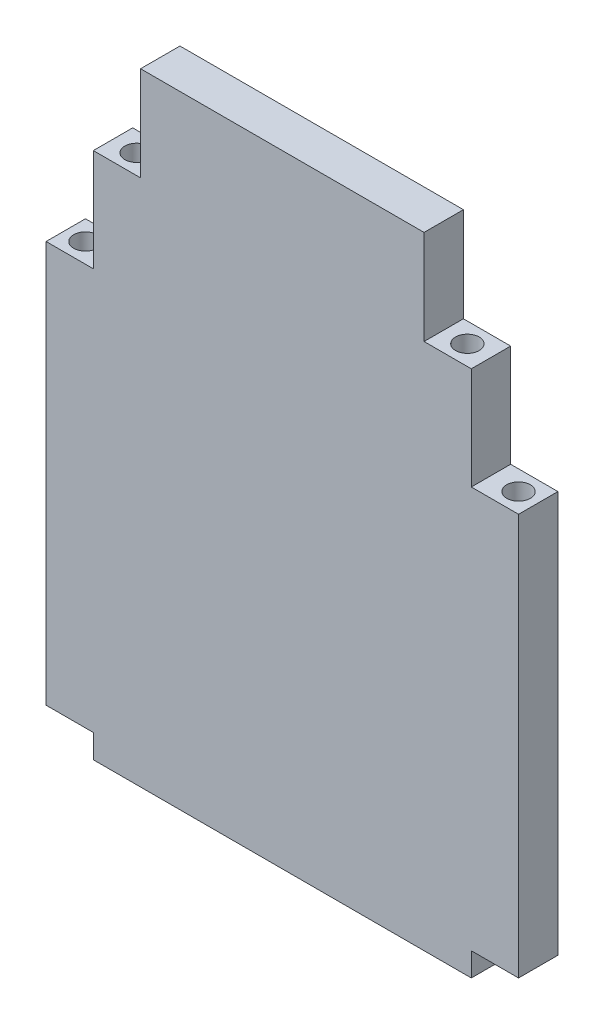
ISO-10303-21;
HEADER;
FILE_DESCRIPTION(('STEP AP214'),'2;1');
FILE_NAME('part.step','',(''),(''),'','','');
FILE_SCHEMA(('AUTOMOTIVE_DESIGN { 1 0 10303 214 1 1 1 1 }'));
ENDSEC;
DATA;
#1=APPLICATION_CONTEXT('core data for automotive mechanical design processes');
#2=APPLICATION_PROTOCOL_DEFINITION('international standard','automotive_design',2000,#1);
#3=PRODUCT_CONTEXT('',#1,'mechanical');
#4=PRODUCT('Part','Part','',(#3));
#5=PRODUCT_RELATED_PRODUCT_CATEGORY('part','',(#4));
#6=PRODUCT_DEFINITION_FORMATION('','',#4);
#7=PRODUCT_DEFINITION_CONTEXT('part definition',#1,'design');
#8=PRODUCT_DEFINITION('design','',#6,#7);
#9=PRODUCT_DEFINITION_SHAPE('','',#8);
#10=(LENGTH_UNIT() NAMED_UNIT(*) SI_UNIT(.MILLI.,.METRE.));
#11=(NAMED_UNIT(*) PLANE_ANGLE_UNIT() SI_UNIT($,.RADIAN.));
#12=(NAMED_UNIT(*) SI_UNIT($,.STERADIAN.) SOLID_ANGLE_UNIT());
#13=UNCERTAINTY_MEASURE_WITH_UNIT(LENGTH_MEASURE(1.E-05),#10,'distance_accuracy_value','');
#14=(GEOMETRIC_REPRESENTATION_CONTEXT(3) GLOBAL_UNCERTAINTY_ASSIGNED_CONTEXT((#13)) GLOBAL_UNIT_ASSIGNED_CONTEXT((#10,
#11,#12)) REPRESENTATION_CONTEXT('',''));
#15=CARTESIAN_POINT('',(0.,0.,0.));
#16=DIRECTION('',(0.,0.,1.));
#17=DIRECTION('',(1.,0.,0.));
#18=AXIS2_PLACEMENT_3D('',#15,#16,#17);
#19=CARTESIAN_POINT('',(-30.,25.5,5.));
#20=DIRECTION('',(0.,-1.,0.));
#21=DIRECTION('',(0.,0.,-1.));
#22=AXIS2_PLACEMENT_3D('',#19,#20,#21);
#23=PLANE('',#22);
#24=CARTESIAN_POINT('',(-27.5,25.5000000000001,2.5));
#25=DIRECTION('',(0.,1.,0.));
#26=DIRECTION('',(-1.,0.,0.));
#27=AXIS2_PLACEMENT_3D('',#24,#25,#26);
#28=CIRCLE('',#27,1.5);
#29=CARTESIAN_POINT('',(-29.,25.5000000000001,2.5));
#30=VERTEX_POINT('',#29);
#31=EDGE_CURVE('E314',#30,#30,#28,.T.);
#32=ORIENTED_EDGE('',*,*,#31,.F.);
#33=EDGE_LOOP('',(#32));
#34=FACE_BOUND('',#33,.T.);
#35=DIRECTION('',(-1.,0.,0.));
#36=VECTOR('',#35,1.);
#37=CARTESIAN_POINT('',(-30.,25.5,0.));
#38=LINE('',#37,#36);
#39=CARTESIAN_POINT('',(-24.,25.5,0.));
#40=VERTEX_POINT('',#39);
#41=CARTESIAN_POINT('',(-30.,25.5,0.));
#42=VERTEX_POINT('',#41);
#43=EDGE_CURVE('E177',#40,#42,#38,.T.);
#44=ORIENTED_EDGE('',*,*,#43,.T.);
#45=DIRECTION('',(0.,0.,-1.));
#46=VECTOR('',#45,1.);
#47=CARTESIAN_POINT('',(-30.,25.5,5.));
#48=LINE('',#47,#46);
#49=CARTESIAN_POINT('',(-30.,25.5,5.));
#50=VERTEX_POINT('',#49);
#51=EDGE_CURVE('E11',#50,#42,#48,.T.);
#52=ORIENTED_EDGE('',*,*,#51,.F.);
#53=DIRECTION('',(-1.,0.,0.));
#54=VECTOR('',#53,1.);
#55=CARTESIAN_POINT('',(-30.,25.5,5.));
#56=LINE('',#55,#54);
#57=CARTESIAN_POINT('',(-24.,25.5,5.));
#58=VERTEX_POINT('',#57);
#59=EDGE_CURVE('E208',#58,#50,#56,.T.);
#60=ORIENTED_EDGE('',*,*,#59,.F.);
#61=DIRECTION('',(0.,0.,-1.));
#62=VECTOR('',#61,1.);
#63=CARTESIAN_POINT('',(-24.,25.5,5.));
#64=LINE('',#63,#62);
#65=EDGE_CURVE('E173',#58,#40,#64,.T.);
#66=ORIENTED_EDGE('',*,*,#65,.T.);
#67=EDGE_LOOP('',(#44,#52,#60,#66));
#68=FACE_BOUND('',#67,.T.);
#69=ADVANCED_FACE('F33',(#34,#68),#23,.F.);
#70=CARTESIAN_POINT('',(-30.,-25.5,5.));
#71=DIRECTION('',(1.,0.,0.));
#72=DIRECTION('',(0.,0.,-1.));
#73=AXIS2_PLACEMENT_3D('',#70,#71,#72);
#74=PLANE('',#73);
#75=DIRECTION('',(0.,-1.,0.));
#76=VECTOR('',#75,1.);
#77=CARTESIAN_POINT('',(-30.,-25.5,0.));
#78=LINE('',#77,#76);
#79=CARTESIAN_POINT('',(-30.,-25.5,0.));
#80=VERTEX_POINT('',#79);
#81=EDGE_CURVE('E180',#42,#80,#78,.T.);
#82=ORIENTED_EDGE('',*,*,#81,.T.);
#83=DIRECTION('',(0.,0.,-1.));
#84=VECTOR('',#83,1.);
#85=CARTESIAN_POINT('',(-30.,-25.5,5.));
#86=LINE('',#85,#84);
#87=CARTESIAN_POINT('',(-30.,-25.5,5.));
#88=VERTEX_POINT('',#87);
#89=EDGE_CURVE('E41',#88,#80,#86,.T.);
#90=ORIENTED_EDGE('',*,*,#89,.F.);
#91=DIRECTION('',(0.,-1.,0.));
#92=VECTOR('',#91,1.);
#93=CARTESIAN_POINT('',(-30.,-25.5,5.));
#94=LINE('',#93,#92);
#95=EDGE_CURVE('E116',#50,#88,#94,.T.);
#96=ORIENTED_EDGE('',*,*,#95,.F.);
#97=ORIENTED_EDGE('',*,*,#51,.T.);
#98=EDGE_LOOP('',(#82,#90,#96,#97));
#99=FACE_BOUND('',#98,.T.);
#100=ADVANCED_FACE('F307',(#99),#74,.F.);
#101=CARTESIAN_POINT('',(-30.,-25.5,5.));
#102=DIRECTION('',(0.,1.,0.));
#103=DIRECTION('',(0.,0.,1.));
#104=AXIS2_PLACEMENT_3D('',#101,#102,#103);
#105=PLANE('',#104);
#106=CARTESIAN_POINT('',(-27.5,-25.5000000000001,2.5));
#107=DIRECTION('',(0.,1.,0.));
#108=DIRECTION('',(-1.,0.,0.));
#109=AXIS2_PLACEMENT_3D('',#106,#107,#108);
#110=CIRCLE('',#109,1.5);
#111=CARTESIAN_POINT('',(-29.,-25.5000000000001,2.5));
#112=VERTEX_POINT('',#111);
#113=EDGE_CURVE('E332',#112,#112,#110,.T.);
#114=ORIENTED_EDGE('',*,*,#113,.T.);
#115=EDGE_LOOP('',(#114));
#116=FACE_BOUND('',#115,.T.);
#117=DIRECTION('',(1.,0.,0.));
#118=VECTOR('',#117,1.);
#119=CARTESIAN_POINT('',(-30.,-25.5,0.));
#120=LINE('',#119,#118);
#121=CARTESIAN_POINT('',(-24.,-25.5,0.));
#122=VERTEX_POINT('',#121);
#123=EDGE_CURVE('E183',#80,#122,#120,.T.);
#124=ORIENTED_EDGE('',*,*,#123,.T.);
#125=DIRECTION('',(0.,0.,-1.));
#126=VECTOR('',#125,1.);
#127=CARTESIAN_POINT('',(-24.,-25.5,5.));
#128=LINE('',#127,#126);
#129=CARTESIAN_POINT('',(-24.,-25.5,5.));
#130=VERTEX_POINT('',#129);
#131=EDGE_CURVE('E239',#130,#122,#128,.T.);
#132=ORIENTED_EDGE('',*,*,#131,.F.);
#133=DIRECTION('',(1.,0.,0.));
#134=VECTOR('',#133,1.);
#135=CARTESIAN_POINT('',(-30.,-25.5,5.));
#136=LINE('',#135,#134);
#137=EDGE_CURVE('E247',#88,#130,#136,.T.);
#138=ORIENTED_EDGE('',*,*,#137,.F.);
#139=ORIENTED_EDGE('',*,*,#89,.T.);
#140=EDGE_LOOP('',(#124,#132,#138,#139));
#141=FACE_BOUND('',#140,.T.);
#142=ADVANCED_FACE('F245',(#116,#141),#105,.F.);
#143=CARTESIAN_POINT('',(-24.,-25.5,5.));
#144=DIRECTION('',(1.,0.,0.));
#145=DIRECTION('',(0.,0.,-1.));
#146=AXIS2_PLACEMENT_3D('',#143,#144,#145);
#147=PLANE('',#146);
#148=DIRECTION('',(0.,-1.,0.));
#149=VECTOR('',#148,1.);
#150=CARTESIAN_POINT('',(-24.,-25.5,0.));
#151=LINE('',#150,#149);
#152=CARTESIAN_POINT('',(-24.,-28.5,0.));
#153=VERTEX_POINT('',#152);
#154=EDGE_CURVE('E185',#122,#153,#151,.T.);
#155=ORIENTED_EDGE('',*,*,#154,.T.);
#156=DIRECTION('',(0.,0.,-1.));
#157=VECTOR('',#156,1.);
#158=CARTESIAN_POINT('',(-24.,-28.5,5.));
#159=LINE('',#158,#157);
#160=CARTESIAN_POINT('',(-24.,-28.5,5.));
#161=VERTEX_POINT('',#160);
#162=EDGE_CURVE('E236',#161,#153,#159,.T.);
#163=ORIENTED_EDGE('',*,*,#162,.F.);
#164=DIRECTION('',(0.,-1.,0.));
#165=VECTOR('',#164,1.);
#166=CARTESIAN_POINT('',(-24.,-25.5,5.));
#167=LINE('',#166,#165);
#168=EDGE_CURVE('E265',#130,#161,#167,.T.);
#169=ORIENTED_EDGE('',*,*,#168,.F.);
#170=ORIENTED_EDGE('',*,*,#131,.T.);
#171=EDGE_LOOP('',(#155,#163,#169,#170));
#172=FACE_BOUND('',#171,.T.);
#173=ADVANCED_FACE('F256',(#172),#147,.F.);
#174=CARTESIAN_POINT('',(-24.,-28.5,5.));
#175=DIRECTION('',(0.,1.,0.));
#176=DIRECTION('',(0.,0.,1.));
#177=AXIS2_PLACEMENT_3D('',#174,#175,#176);
#178=PLANE('',#177);
#179=DIRECTION('',(1.,0.,0.));
#180=VECTOR('',#179,1.);
#181=CARTESIAN_POINT('',(-24.,-28.5,0.));
#182=LINE('',#181,#180);
#183=CARTESIAN_POINT('',(24.,-28.5,0.));
#184=VERTEX_POINT('',#183);
#185=EDGE_CURVE('E187',#153,#184,#182,.T.);
#186=ORIENTED_EDGE('',*,*,#185,.T.);
#187=DIRECTION('',(0.,0.,-1.));
#188=VECTOR('',#187,1.);
#189=CARTESIAN_POINT('',(24.,-28.5,5.));
#190=LINE('',#189,#188);
#191=CARTESIAN_POINT('',(24.,-28.5,5.));
#192=VERTEX_POINT('',#191);
#193=EDGE_CURVE('E233',#192,#184,#190,.T.);
#194=ORIENTED_EDGE('',*,*,#193,.F.);
#195=DIRECTION('',(1.,0.,0.));
#196=VECTOR('',#195,1.);
#197=CARTESIAN_POINT('',(-24.,-28.5,5.));
#198=LINE('',#197,#196);
#199=EDGE_CURVE('E262',#161,#192,#198,.T.);
#200=ORIENTED_EDGE('',*,*,#199,.F.);
#201=ORIENTED_EDGE('',*,*,#162,.T.);
#202=EDGE_LOOP('',(#186,#194,#200,#201));
#203=FACE_BOUND('',#202,.T.);
#204=ADVANCED_FACE('F260',(#203),#178,.F.);
#205=CARTESIAN_POINT('',(24.,-28.5,5.));
#206=DIRECTION('',(-1.,0.,0.));
#207=DIRECTION('',(0.,-1.,0.));
#208=AXIS2_PLACEMENT_3D('',#205,#206,#207);
#209=PLANE('',#208);
#210=DIRECTION('',(0.,1.,0.));
#211=VECTOR('',#210,1.);
#212=CARTESIAN_POINT('',(24.,-28.5,0.));
#213=LINE('',#212,#211);
#214=CARTESIAN_POINT('',(24.,-25.5,0.));
#215=VERTEX_POINT('',#214);
#216=EDGE_CURVE('E189',#184,#215,#213,.T.);
#217=ORIENTED_EDGE('',*,*,#216,.T.);
#218=DIRECTION('',(0.,0.,-1.));
#219=VECTOR('',#218,1.);
#220=CARTESIAN_POINT('',(24.,-25.5,5.));
#221=LINE('',#220,#219);
#222=CARTESIAN_POINT('',(24.,-25.5,5.));
#223=VERTEX_POINT('',#222);
#224=EDGE_CURVE('E230',#223,#215,#221,.T.);
#225=ORIENTED_EDGE('',*,*,#224,.F.);
#226=DIRECTION('',(0.,1.,0.));
#227=VECTOR('',#226,1.);
#228=CARTESIAN_POINT('',(24.,-28.5,5.));
#229=LINE('',#228,#227);
#230=EDGE_CURVE('E264',#192,#223,#229,.T.);
#231=ORIENTED_EDGE('',*,*,#230,.F.);
#232=ORIENTED_EDGE('',*,*,#193,.T.);
#233=EDGE_LOOP('',(#217,#225,#231,#232));
#234=FACE_BOUND('',#233,.T.);
#235=ADVANCED_FACE('F392',(#234),#209,.F.);
#236=CARTESIAN_POINT('',(24.,-25.5,5.));
#237=DIRECTION('',(0.,1.,0.));
#238=DIRECTION('',(0.,0.,1.));
#239=AXIS2_PLACEMENT_3D('',#236,#237,#238);
#240=PLANE('',#239);
#241=CARTESIAN_POINT('',(27.5,-25.4999999999999,2.49999999999999));
#242=DIRECTION('',(0.,1.,0.));
#243=DIRECTION('',(1.,0.,0.));
#244=AXIS2_PLACEMENT_3D('',#241,#242,#243);
#245=CIRCLE('',#244,1.5);
#246=CARTESIAN_POINT('',(29.,-25.4999999999999,2.49999999999999));
#247=VERTEX_POINT('',#246);
#248=EDGE_CURVE('E344',#247,#247,#245,.T.);
#249=ORIENTED_EDGE('',*,*,#248,.T.);
#250=EDGE_LOOP('',(#249));
#251=FACE_BOUND('',#250,.T.);
#252=DIRECTION('',(1.,0.,0.));
#253=VECTOR('',#252,1.);
#254=CARTESIAN_POINT('',(24.,-25.5,0.));
#255=LINE('',#254,#253);
#256=CARTESIAN_POINT('',(30.,-25.5,0.));
#257=VERTEX_POINT('',#256);
#258=EDGE_CURVE('E191',#215,#257,#255,.T.);
#259=ORIENTED_EDGE('',*,*,#258,.T.);
#260=DIRECTION('',(0.,0.,-1.));
#261=VECTOR('',#260,1.);
#262=CARTESIAN_POINT('',(30.,-25.5,5.));
#263=LINE('',#262,#261);
#264=CARTESIAN_POINT('',(30.,-25.5,5.));
#265=VERTEX_POINT('',#264);
#266=EDGE_CURVE('E227',#265,#257,#263,.T.);
#267=ORIENTED_EDGE('',*,*,#266,.F.);
#268=DIRECTION('',(1.,0.,0.));
#269=VECTOR('',#268,1.);
#270=CARTESIAN_POINT('',(24.,-25.5,5.));
#271=LINE('',#270,#269);
#272=EDGE_CURVE('E267',#223,#265,#271,.T.);
#273=ORIENTED_EDGE('',*,*,#272,.F.);
#274=ORIENTED_EDGE('',*,*,#224,.T.);
#275=EDGE_LOOP('',(#259,#267,#273,#274));
#276=FACE_BOUND('',#275,.T.);
#277=ADVANCED_FACE('F388',(#251,#276),#240,.F.);
#278=CARTESIAN_POINT('',(30.,-25.5,5.));
#279=DIRECTION('',(-1.,0.,0.));
#280=DIRECTION('',(0.,0.,1.));
#281=AXIS2_PLACEMENT_3D('',#278,#279,#280);
#282=PLANE('',#281);
#283=DIRECTION('',(0.,1.,0.));
#284=VECTOR('',#283,1.);
#285=CARTESIAN_POINT('',(30.,-25.5,0.));
#286=LINE('',#285,#284);
#287=CARTESIAN_POINT('',(30.,25.5,0.));
#288=VERTEX_POINT('',#287);
#289=EDGE_CURVE('E193',#257,#288,#286,.T.);
#290=ORIENTED_EDGE('',*,*,#289,.T.);
#291=DIRECTION('',(0.,0.,-1.));
#292=VECTOR('',#291,1.);
#293=CARTESIAN_POINT('',(30.,25.5,5.));
#294=LINE('',#293,#292);
#295=CARTESIAN_POINT('',(30.,25.5,5.));
#296=VERTEX_POINT('',#295);
#297=EDGE_CURVE('E224',#296,#288,#294,.T.);
#298=ORIENTED_EDGE('',*,*,#297,.F.);
#299=DIRECTION('',(0.,1.,0.));
#300=VECTOR('',#299,1.);
#301=CARTESIAN_POINT('',(30.,-25.5,5.));
#302=LINE('',#301,#300);
#303=EDGE_CURVE('E273',#265,#296,#302,.T.);
#304=ORIENTED_EDGE('',*,*,#303,.F.);
#305=ORIENTED_EDGE('',*,*,#266,.T.);
#306=EDGE_LOOP('',(#290,#298,#304,#305));
#307=FACE_BOUND('',#306,.T.);
#308=ADVANCED_FACE('F384',(#307),#282,.F.);
#309=CARTESIAN_POINT('',(24.,25.5,5.));
#310=DIRECTION('',(0.,-1.,0.));
#311=DIRECTION('',(0.,0.,-1.));
#312=AXIS2_PLACEMENT_3D('',#309,#310,#311);
#313=PLANE('',#312);
#314=CARTESIAN_POINT('',(27.5,25.4999999999999,2.49999999999999));
#315=DIRECTION('',(0.,1.,0.));
#316=DIRECTION('',(1.,0.,0.));
#317=AXIS2_PLACEMENT_3D('',#314,#315,#316);
#318=CIRCLE('',#317,1.5);
#319=CARTESIAN_POINT('',(29.,25.4999999999999,2.49999999999999));
#320=VERTEX_POINT('',#319);
#321=EDGE_CURVE('E321',#320,#320,#318,.T.);
#322=ORIENTED_EDGE('',*,*,#321,.F.);
#323=EDGE_LOOP('',(#322));
#324=FACE_BOUND('',#323,.T.);
#325=DIRECTION('',(-1.,0.,0.));
#326=VECTOR('',#325,1.);
#327=CARTESIAN_POINT('',(24.,25.5,0.));
#328=LINE('',#327,#326);
#329=CARTESIAN_POINT('',(24.,25.5,0.));
#330=VERTEX_POINT('',#329);
#331=EDGE_CURVE('E195',#288,#330,#328,.T.);
#332=ORIENTED_EDGE('',*,*,#331,.T.);
#333=DIRECTION('',(0.,0.,-1.));
#334=VECTOR('',#333,1.);
#335=CARTESIAN_POINT('',(24.,25.5,5.));
#336=LINE('',#335,#334);
#337=CARTESIAN_POINT('',(24.,25.5,5.));
#338=VERTEX_POINT('',#337);
#339=EDGE_CURVE('E221',#338,#330,#336,.T.);
#340=ORIENTED_EDGE('',*,*,#339,.F.);
#341=DIRECTION('',(-1.,0.,0.));
#342=VECTOR('',#341,1.);
#343=CARTESIAN_POINT('',(24.,25.5,5.));
#344=LINE('',#343,#342);
#345=EDGE_CURVE('E275',#296,#338,#344,.T.);
#346=ORIENTED_EDGE('',*,*,#345,.F.);
#347=ORIENTED_EDGE('',*,*,#297,.T.);
#348=EDGE_LOOP('',(#332,#340,#346,#347));
#349=FACE_BOUND('',#348,.T.);
#350=ADVANCED_FACE('F380',(#324,#349),#313,.F.);
#351=CARTESIAN_POINT('',(24.,38.5,5.));
#352=DIRECTION('',(-1.,0.,0.));
#353=DIRECTION('',(0.,0.,1.));
#354=AXIS2_PLACEMENT_3D('',#351,#352,#353);
#355=PLANE('',#354);
#356=DIRECTION('',(0.,1.,0.));
#357=VECTOR('',#356,1.);
#358=CARTESIAN_POINT('',(24.,38.5,0.));
#359=LINE('',#358,#357);
#360=CARTESIAN_POINT('',(24.,38.5,0.));
#361=VERTEX_POINT('',#360);
#362=EDGE_CURVE('E197',#330,#361,#359,.T.);
#363=ORIENTED_EDGE('',*,*,#362,.T.);
#364=DIRECTION('',(0.,0.,-1.));
#365=VECTOR('',#364,1.);
#366=CARTESIAN_POINT('',(24.,38.5,5.));
#367=LINE('',#366,#365);
#368=CARTESIAN_POINT('',(24.,38.5,5.));
#369=VERTEX_POINT('',#368);
#370=EDGE_CURVE('E218',#369,#361,#367,.T.);
#371=ORIENTED_EDGE('',*,*,#370,.F.);
#372=DIRECTION('',(0.,1.,0.));
#373=VECTOR('',#372,1.);
#374=CARTESIAN_POINT('',(24.,38.5,5.));
#375=LINE('',#374,#373);
#376=EDGE_CURVE('E277',#338,#369,#375,.T.);
#377=ORIENTED_EDGE('',*,*,#376,.F.);
#378=ORIENTED_EDGE('',*,*,#339,.T.);
#379=EDGE_LOOP('',(#363,#371,#377,#378));
#380=FACE_BOUND('',#379,.T.);
#381=ADVANCED_FACE('F368',(#380),#355,.F.);
#382=CARTESIAN_POINT('',(18.,38.5,5.));
#383=DIRECTION('',(0.,-1.,0.));
#384=DIRECTION('',(0.,0.,-1.));
#385=AXIS2_PLACEMENT_3D('',#382,#383,#384);
#386=PLANE('',#385);
#387=CARTESIAN_POINT('',(21.,38.5,2.5));
#388=DIRECTION('',(0.,1.,0.));
#389=DIRECTION('',(0.,0.,-1.));
#390=AXIS2_PLACEMENT_3D('',#387,#388,#389);
#391=CIRCLE('',#390,1.5);
#392=CARTESIAN_POINT('',(21.,38.5,0.999999999999995));
#393=VERTEX_POINT('',#392);
#394=EDGE_CURVE('E340',#393,#393,#391,.T.);
#395=ORIENTED_EDGE('',*,*,#394,.F.);
#396=EDGE_LOOP('',(#395));
#397=FACE_BOUND('',#396,.T.);
#398=DIRECTION('',(-1.,0.,0.));
#399=VECTOR('',#398,1.);
#400=CARTESIAN_POINT('',(18.,38.5,0.));
#401=LINE('',#400,#399);
#402=CARTESIAN_POINT('',(18.,38.5,0.));
#403=VERTEX_POINT('',#402);
#404=EDGE_CURVE('E199',#361,#403,#401,.T.);
#405=ORIENTED_EDGE('',*,*,#404,.T.);
#406=DIRECTION('',(0.,0.,-1.));
#407=VECTOR('',#406,1.);
#408=CARTESIAN_POINT('',(18.,38.5,5.));
#409=LINE('',#408,#407);
#410=CARTESIAN_POINT('',(18.,38.5,5.));
#411=VERTEX_POINT('',#410);
#412=EDGE_CURVE('E215',#411,#403,#409,.T.);
#413=ORIENTED_EDGE('',*,*,#412,.F.);
#414=DIRECTION('',(-1.,0.,0.));
#415=VECTOR('',#414,1.);
#416=CARTESIAN_POINT('',(18.,38.5,5.));
#417=LINE('',#416,#415);
#418=EDGE_CURVE('E279',#369,#411,#417,.T.);
#419=ORIENTED_EDGE('',*,*,#418,.F.);
#420=ORIENTED_EDGE('',*,*,#370,.T.);
#421=EDGE_LOOP('',(#405,#413,#419,#420));
#422=FACE_BOUND('',#421,.T.);
#423=ADVANCED_FACE('F365',(#397,#422),#386,.F.);
#424=CARTESIAN_POINT('',(17.9999999999999,50.5,5.));
#425=DIRECTION('',(-1.,0.,0.));
#426=DIRECTION('',(0.,-1.,0.));
#427=AXIS2_PLACEMENT_3D('',#424,#425,#426);
#428=PLANE('',#427);
#429=DIRECTION('',(0.,1.,0.));
#430=VECTOR('',#429,1.);
#431=CARTESIAN_POINT('',(17.9999999999999,50.5,0.));
#432=LINE('',#431,#430);
#433=CARTESIAN_POINT('',(17.9999999999999,50.5,0.));
#434=VERTEX_POINT('',#433);
#435=EDGE_CURVE('E201',#403,#434,#432,.T.);
#436=ORIENTED_EDGE('',*,*,#435,.T.);
#437=DIRECTION('',(0.,0.,-1.));
#438=VECTOR('',#437,1.);
#439=CARTESIAN_POINT('',(17.9999999999999,50.5,5.));
#440=LINE('',#439,#438);
#441=CARTESIAN_POINT('',(17.9999999999999,50.5,5.));
#442=VERTEX_POINT('',#441);
#443=EDGE_CURVE('E212',#442,#434,#440,.T.);
#444=ORIENTED_EDGE('',*,*,#443,.F.);
#445=DIRECTION('',(0.,1.,0.));
#446=VECTOR('',#445,1.);
#447=CARTESIAN_POINT('',(17.9999999999999,50.5,5.));
#448=LINE('',#447,#446);
#449=EDGE_CURVE('E281',#411,#442,#448,.T.);
#450=ORIENTED_EDGE('',*,*,#449,.F.);
#451=ORIENTED_EDGE('',*,*,#412,.T.);
#452=EDGE_LOOP('',(#436,#444,#450,#451));
#453=FACE_BOUND('',#452,.T.);
#454=ADVANCED_FACE('F287',(#453),#428,.F.);
#455=CARTESIAN_POINT('',(-18.,50.5,5.));
#456=DIRECTION('',(0.,-1.,0.));
#457=DIRECTION('',(0.,0.,-1.));
#458=AXIS2_PLACEMENT_3D('',#455,#456,#457);
#459=PLANE('',#458);
#460=DIRECTION('',(-1.,0.,0.));
#461=VECTOR('',#460,1.);
#462=CARTESIAN_POINT('',(-18.,50.5,0.));
#463=LINE('',#462,#461);
#464=CARTESIAN_POINT('',(-18.,50.5,0.));
#465=VERTEX_POINT('',#464);
#466=EDGE_CURVE('E203',#434,#465,#463,.T.);
#467=ORIENTED_EDGE('',*,*,#466,.T.);
#468=DIRECTION('',(0.,0.,-1.));
#469=VECTOR('',#468,1.);
#470=CARTESIAN_POINT('',(-18.,50.5,5.));
#471=LINE('',#470,#469);
#472=CARTESIAN_POINT('',(-18.,50.5,5.));
#473=VERTEX_POINT('',#472);
#474=EDGE_CURVE('E168',#473,#465,#471,.T.);
#475=ORIENTED_EDGE('',*,*,#474,.F.);
#476=DIRECTION('',(-1.,0.,0.));
#477=VECTOR('',#476,1.);
#478=CARTESIAN_POINT('',(-18.,50.5,5.));
#479=LINE('',#478,#477);
#480=EDGE_CURVE('E159',#442,#473,#479,.T.);
#481=ORIENTED_EDGE('',*,*,#480,.F.);
#482=ORIENTED_EDGE('',*,*,#443,.T.);
#483=EDGE_LOOP('',(#467,#475,#481,#482));
#484=FACE_BOUND('',#483,.T.);
#485=ADVANCED_FACE('F291',(#484),#459,.F.);
#486=CARTESIAN_POINT('',(-18.,38.5,5.));
#487=DIRECTION('',(1.,0.,0.));
#488=DIRECTION('',(0.,0.,-1.));
#489=AXIS2_PLACEMENT_3D('',#486,#487,#488);
#490=PLANE('',#489);
#491=DIRECTION('',(0.,-1.,0.));
#492=VECTOR('',#491,1.);
#493=CARTESIAN_POINT('',(-18.,38.5,0.));
#494=LINE('',#493,#492);
#495=CARTESIAN_POINT('',(-18.,38.5,0.));
#496=VERTEX_POINT('',#495);
#497=EDGE_CURVE('E167',#465,#496,#494,.T.);
#498=ORIENTED_EDGE('',*,*,#497,.T.);
#499=DIRECTION('',(0.,0.,-1.));
#500=VECTOR('',#499,1.);
#501=CARTESIAN_POINT('',(-18.,38.5,5.));
#502=LINE('',#501,#500);
#503=CARTESIAN_POINT('',(-18.,38.5,5.));
#504=VERTEX_POINT('',#503);
#505=EDGE_CURVE('E164',#504,#496,#502,.T.);
#506=ORIENTED_EDGE('',*,*,#505,.F.);
#507=DIRECTION('',(0.,-1.,0.));
#508=VECTOR('',#507,1.);
#509=CARTESIAN_POINT('',(-18.,38.5,5.));
#510=LINE('',#509,#508);
#511=EDGE_CURVE('E153',#473,#504,#510,.T.);
#512=ORIENTED_EDGE('',*,*,#511,.F.);
#513=ORIENTED_EDGE('',*,*,#474,.T.);
#514=EDGE_LOOP('',(#498,#506,#512,#513));
#515=FACE_BOUND('',#514,.T.);
#516=ADVANCED_FACE('F165',(#515),#490,.F.);
#517=CARTESIAN_POINT('',(-24.,38.5,5.));
#518=DIRECTION('',(0.,-1.,0.));
#519=DIRECTION('',(0.,0.,-1.));
#520=AXIS2_PLACEMENT_3D('',#517,#518,#519);
#521=PLANE('',#520);
#522=CARTESIAN_POINT('',(-21.,38.5,2.5));
#523=DIRECTION('',(0.,1.,0.));
#524=DIRECTION('',(0.,0.,1.));
#525=AXIS2_PLACEMENT_3D('',#522,#523,#524);
#526=CIRCLE('',#525,1.5);
#527=CARTESIAN_POINT('',(-21.,38.5,4.));
#528=VERTEX_POINT('',#527);
#529=EDGE_CURVE('E350',#528,#528,#526,.T.);
#530=ORIENTED_EDGE('',*,*,#529,.F.);
#531=EDGE_LOOP('',(#530));
#532=FACE_BOUND('',#531,.T.);
#533=DIRECTION('',(-1.,0.,0.));
#534=VECTOR('',#533,1.);
#535=CARTESIAN_POINT('',(-24.,38.5,0.));
#536=LINE('',#535,#534);
#537=CARTESIAN_POINT('',(-24.,38.5,0.));
#538=VERTEX_POINT('',#537);
#539=EDGE_CURVE('E102',#496,#538,#536,.T.);
#540=ORIENTED_EDGE('',*,*,#539,.T.);
#541=DIRECTION('',(0.,0.,-1.));
#542=VECTOR('',#541,1.);
#543=CARTESIAN_POINT('',(-24.,38.5,5.));
#544=LINE('',#543,#542);
#545=CARTESIAN_POINT('',(-24.,38.5,5.));
#546=VERTEX_POINT('',#545);
#547=EDGE_CURVE('E169',#546,#538,#544,.T.);
#548=ORIENTED_EDGE('',*,*,#547,.F.);
#549=DIRECTION('',(-1.,0.,0.));
#550=VECTOR('',#549,1.);
#551=CARTESIAN_POINT('',(-24.,38.5,5.));
#552=LINE('',#551,#550);
#553=EDGE_CURVE('E157',#504,#546,#552,.T.);
#554=ORIENTED_EDGE('',*,*,#553,.F.);
#555=ORIENTED_EDGE('',*,*,#505,.T.);
#556=EDGE_LOOP('',(#540,#548,#554,#555));
#557=FACE_BOUND('',#556,.T.);
#558=ADVANCED_FACE('F171',(#532,#557),#521,.F.);
#559=CARTESIAN_POINT('',(-24.,25.5,5.));
#560=DIRECTION('',(1.,0.,0.));
#561=DIRECTION('',(0.,1.,0.));
#562=AXIS2_PLACEMENT_3D('',#559,#560,#561);
#563=PLANE('',#562);
#564=DIRECTION('',(0.,-1.,0.));
#565=VECTOR('',#564,1.);
#566=CARTESIAN_POINT('',(-24.,25.5,0.));
#567=LINE('',#566,#565);
#568=EDGE_CURVE('E108',#538,#40,#567,.T.);
#569=ORIENTED_EDGE('',*,*,#568,.T.);
#570=ORIENTED_EDGE('',*,*,#65,.F.);
#571=DIRECTION('',(0.,-1.,0.));
#572=VECTOR('',#571,1.);
#573=CARTESIAN_POINT('',(-24.,25.5,5.));
#574=LINE('',#573,#572);
#575=EDGE_CURVE('E49',#546,#58,#574,.T.);
#576=ORIENTED_EDGE('',*,*,#575,.F.);
#577=ORIENTED_EDGE('',*,*,#547,.T.);
#578=EDGE_LOOP('',(#569,#570,#576,#577));
#579=FACE_BOUND('',#578,.T.);
#580=ADVANCED_FACE('F295',(#579),#563,.F.);
#581=CARTESIAN_POINT('',(0.,0.,5.));
#582=DIRECTION('',(0.,0.,1.));
#583=DIRECTION('',(1.,0.,0.));
#584=AXIS2_PLACEMENT_3D('',#581,#582,#583);
#585=PLANE('',#584);
#586=ORIENTED_EDGE('',*,*,#59,.T.);
#587=ORIENTED_EDGE('',*,*,#95,.T.);
#588=ORIENTED_EDGE('',*,*,#137,.T.);
#589=ORIENTED_EDGE('',*,*,#168,.T.);
#590=ORIENTED_EDGE('',*,*,#199,.T.);
#591=ORIENTED_EDGE('',*,*,#230,.T.);
#592=ORIENTED_EDGE('',*,*,#272,.T.);
#593=ORIENTED_EDGE('',*,*,#303,.T.);
#594=ORIENTED_EDGE('',*,*,#345,.T.);
#595=ORIENTED_EDGE('',*,*,#376,.T.);
#596=ORIENTED_EDGE('',*,*,#418,.T.);
#597=ORIENTED_EDGE('',*,*,#449,.T.);
#598=ORIENTED_EDGE('',*,*,#480,.T.);
#599=ORIENTED_EDGE('',*,*,#511,.T.);
#600=ORIENTED_EDGE('',*,*,#553,.T.);
#601=ORIENTED_EDGE('',*,*,#575,.T.);
#602=EDGE_LOOP('',(#586,#587,#588,#589,#590,#591,#592,#593,#594,#595,#596,#597,#598,#599,#600,#601));
#603=FACE_BOUND('',#602,.T.);
#604=ADVANCED_FACE('F155',(#603),#585,.T.);
#605=CARTESIAN_POINT('',(0.,0.,0.));
#606=DIRECTION('',(0.,0.,1.));
#607=DIRECTION('',(1.,0.,0.));
#608=AXIS2_PLACEMENT_3D('',#605,#606,#607);
#609=PLANE('',#608);
#610=ORIENTED_EDGE('',*,*,#43,.F.);
#611=ORIENTED_EDGE('',*,*,#568,.F.);
#612=ORIENTED_EDGE('',*,*,#539,.F.);
#613=ORIENTED_EDGE('',*,*,#497,.F.);
#614=ORIENTED_EDGE('',*,*,#466,.F.);
#615=ORIENTED_EDGE('',*,*,#435,.F.);
#616=ORIENTED_EDGE('',*,*,#404,.F.);
#617=ORIENTED_EDGE('',*,*,#362,.F.);
#618=ORIENTED_EDGE('',*,*,#331,.F.);
#619=ORIENTED_EDGE('',*,*,#289,.F.);
#620=ORIENTED_EDGE('',*,*,#258,.F.);
#621=ORIENTED_EDGE('',*,*,#216,.F.);
#622=ORIENTED_EDGE('',*,*,#185,.F.);
#623=ORIENTED_EDGE('',*,*,#154,.F.);
#624=ORIENTED_EDGE('',*,*,#123,.F.);
#625=ORIENTED_EDGE('',*,*,#81,.F.);
#626=EDGE_LOOP('',(#610,#611,#612,#613,#614,#615,#616,#617,#618,#619,#620,#621,#622,#623,#624,#625));
#627=FACE_BOUND('',#626,.T.);
#628=ADVANCED_FACE('F251',(#627),#609,.F.);
#629=CARTESIAN_POINT('',(27.4999999999999,15.4999999999999,2.49999999999999));
#630=DIRECTION('',(0.,1.,0.));
#631=DIRECTION('',(-1.,0.,0.));
#632=AXIS2_PLACEMENT_3D('',#629,#630,#631);
#633=CYLINDRICAL_SURFACE('',#632,1.5);
#634=CARTESIAN_POINT('',(27.4999999999999,15.4999999999999,2.49999999999999));
#635=DIRECTION('',(0.,1.,0.));
#636=DIRECTION('',(1.,0.,0.));
#637=AXIS2_PLACEMENT_3D('',#634,#635,#636);
#638=CIRCLE('',#637,1.5);
#639=CARTESIAN_POINT('',(28.9999999999999,15.4999999999999,2.49999999999999));
#640=VERTEX_POINT('',#639);
#641=EDGE_CURVE('E316',#640,#640,#638,.T.);
#642=ORIENTED_EDGE('',*,*,#641,.F.);
#643=EDGE_LOOP('',(#642));
#644=FACE_BOUND('',#643,.T.);
#645=ORIENTED_EDGE('',*,*,#321,.T.);
#646=EDGE_LOOP('',(#645));
#647=FACE_BOUND('',#646,.T.);
#648=ADVANCED_FACE('F442',(#644,#647),#633,.F.);
#649=CARTESIAN_POINT('',(27.4999999999999,15.4999999999999,2.49999999999999));
#650=DIRECTION('',(0.,-1.,0.));
#651=DIRECTION('',(1.,0.,0.));
#652=AXIS2_PLACEMENT_3D('',#649,#650,#651);
#653=PLANE('',#652);
#654=ORIENTED_EDGE('',*,*,#641,.T.);
#655=EDGE_LOOP('',(#654));
#656=FACE_BOUND('',#655,.T.);
#657=ADVANCED_FACE('F438',(#656),#653,.F.);
#658=CARTESIAN_POINT('',(-27.5,15.5000000000001,2.5));
#659=DIRECTION('',(0.,1.,0.));
#660=DIRECTION('',(-1.,0.,0.));
#661=AXIS2_PLACEMENT_3D('',#658,#659,#660);
#662=CYLINDRICAL_SURFACE('',#661,1.5);
#663=CARTESIAN_POINT('',(-27.5,15.5000000000001,2.5));
#664=DIRECTION('',(0.,1.,0.));
#665=DIRECTION('',(-1.,0.,0.));
#666=AXIS2_PLACEMENT_3D('',#663,#664,#665);
#667=CIRCLE('',#666,1.5);
#668=CARTESIAN_POINT('',(-29.,15.5000000000001,2.5));
#669=VERTEX_POINT('',#668);
#670=EDGE_CURVE('E181',#669,#669,#667,.T.);
#671=ORIENTED_EDGE('',*,*,#670,.F.);
#672=EDGE_LOOP('',(#671));
#673=FACE_BOUND('',#672,.T.);
#674=ORIENTED_EDGE('',*,*,#31,.T.);
#675=EDGE_LOOP('',(#674));
#676=FACE_BOUND('',#675,.T.);
#677=ADVANCED_FACE('F434',(#673,#676),#662,.F.);
#678=CARTESIAN_POINT('',(-27.5,15.5000000000001,2.5));
#679=DIRECTION('',(0.,1.,0.));
#680=DIRECTION('',(-1.,0.,0.));
#681=AXIS2_PLACEMENT_3D('',#678,#679,#680);
#682=PLANE('',#681);
#683=ORIENTED_EDGE('',*,*,#670,.T.);
#684=EDGE_LOOP('',(#683));
#685=FACE_BOUND('',#684,.T.);
#686=ADVANCED_FACE('F430',(#685),#682,.T.);
#687=CARTESIAN_POINT('',(27.4999999999999,-15.4999999999999,2.49999999999999));
#688=DIRECTION('',(0.,-1.,0.));
#689=DIRECTION('',(1.,0.,0.));
#690=AXIS2_PLACEMENT_3D('',#687,#688,#689);
#691=CYLINDRICAL_SURFACE('',#690,1.5);
#692=CARTESIAN_POINT('',(27.4999999999999,-15.4999999999999,2.49999999999999));
#693=DIRECTION('',(0.,1.,0.));
#694=DIRECTION('',(1.,0.,0.));
#695=AXIS2_PLACEMENT_3D('',#692,#693,#694);
#696=CIRCLE('',#695,1.5);
#697=CARTESIAN_POINT('',(28.9999999999999,-15.4999999999999,2.49999999999999));
#698=VERTEX_POINT('',#697);
#699=EDGE_CURVE('E337',#698,#698,#696,.T.);
#700=ORIENTED_EDGE('',*,*,#699,.T.);
#701=EDGE_LOOP('',(#700));
#702=FACE_BOUND('',#701,.T.);
#703=ORIENTED_EDGE('',*,*,#248,.F.);
#704=EDGE_LOOP('',(#703));
#705=FACE_BOUND('',#704,.T.);
#706=ADVANCED_FACE('F423',(#702,#705),#691,.F.);
#707=CARTESIAN_POINT('',(27.4999999999999,-15.4999999999999,2.49999999999999));
#708=DIRECTION('',(0.,1.,0.));
#709=DIRECTION('',(1.,0.,0.));
#710=AXIS2_PLACEMENT_3D('',#707,#708,#709);
#711=PLANE('',#710);
#712=ORIENTED_EDGE('',*,*,#699,.F.);
#713=EDGE_LOOP('',(#712));
#714=FACE_BOUND('',#713,.T.);
#715=ADVANCED_FACE('F414',(#714),#711,.F.);
#716=CARTESIAN_POINT('',(-27.5,-15.5000000000001,2.5));
#717=DIRECTION('',(0.,-1.,0.));
#718=DIRECTION('',(1.,0.,0.));
#719=AXIS2_PLACEMENT_3D('',#716,#717,#718);
#720=CYLINDRICAL_SURFACE('',#719,1.5);
#721=CARTESIAN_POINT('',(-27.5,-15.5000000000001,2.5));
#722=DIRECTION('',(0.,1.,0.));
#723=DIRECTION('',(-1.,0.,0.));
#724=AXIS2_PLACEMENT_3D('',#721,#722,#723);
#725=CIRCLE('',#724,1.5);
#726=CARTESIAN_POINT('',(-29.,-15.5000000000001,2.5));
#727=VERTEX_POINT('',#726);
#728=EDGE_CURVE('E327',#727,#727,#725,.T.);
#729=ORIENTED_EDGE('',*,*,#728,.T.);
#730=EDGE_LOOP('',(#729));
#731=FACE_BOUND('',#730,.T.);
#732=ORIENTED_EDGE('',*,*,#113,.F.);
#733=EDGE_LOOP('',(#732));
#734=FACE_BOUND('',#733,.T.);
#735=ADVANCED_FACE('F411',(#731,#734),#720,.F.);
#736=CARTESIAN_POINT('',(-27.5,-15.5000000000001,2.5));
#737=DIRECTION('',(0.,-1.,0.));
#738=DIRECTION('',(-1.,0.,0.));
#739=AXIS2_PLACEMENT_3D('',#736,#737,#738);
#740=PLANE('',#739);
#741=ORIENTED_EDGE('',*,*,#728,.F.);
#742=EDGE_LOOP('',(#741));
#743=FACE_BOUND('',#742,.T.);
#744=ADVANCED_FACE('F413',(#743),#740,.T.);
#745=CARTESIAN_POINT('',(-21.,28.5,2.5));
#746=DIRECTION('',(0.,1.,0.));
#747=DIRECTION('',(0.,0.,1.));
#748=AXIS2_PLACEMENT_3D('',#745,#746,#747);
#749=CYLINDRICAL_SURFACE('',#748,1.5);
#750=CARTESIAN_POINT('',(-21.,28.5,2.5));
#751=DIRECTION('',(0.,1.,0.));
#752=DIRECTION('',(0.,0.,1.));
#753=AXIS2_PLACEMENT_3D('',#750,#751,#752);
#754=CIRCLE('',#753,1.5);
#755=CARTESIAN_POINT('',(-21.,28.5,4.));
#756=VERTEX_POINT('',#755);
#757=EDGE_CURVE('E346',#756,#756,#754,.T.);
#758=ORIENTED_EDGE('',*,*,#757,.F.);
#759=EDGE_LOOP('',(#758));
#760=FACE_BOUND('',#759,.T.);
#761=ORIENTED_EDGE('',*,*,#529,.T.);
#762=EDGE_LOOP('',(#761));
#763=FACE_BOUND('',#762,.T.);
#764=ADVANCED_FACE('F420',(#760,#763),#749,.F.);
#765=CARTESIAN_POINT('',(-21.,28.5,2.5));
#766=DIRECTION('',(0.,1.,0.));
#767=DIRECTION('',(0.,0.,1.));
#768=AXIS2_PLACEMENT_3D('',#765,#766,#767);
#769=PLANE('',#768);
#770=ORIENTED_EDGE('',*,*,#757,.T.);
#771=EDGE_LOOP('',(#770));
#772=FACE_BOUND('',#771,.T.);
#773=ADVANCED_FACE('F515',(#772),#769,.T.);
#774=CARTESIAN_POINT('',(21.,28.5,2.5));
#775=DIRECTION('',(0.,1.,0.));
#776=DIRECTION('',(0.,0.,1.));
#777=AXIS2_PLACEMENT_3D('',#774,#775,#776);
#778=CYLINDRICAL_SURFACE('',#777,1.5);
#779=CARTESIAN_POINT('',(21.,28.5,2.5));
#780=DIRECTION('',(0.,1.,0.));
#781=DIRECTION('',(0.,0.,-1.));
#782=AXIS2_PLACEMENT_3D('',#779,#780,#781);
#783=CIRCLE('',#782,1.5);
#784=CARTESIAN_POINT('',(21.,28.5,0.999999999999995));
#785=VERTEX_POINT('',#784);
#786=EDGE_CURVE('E355',#785,#785,#783,.T.);
#787=ORIENTED_EDGE('',*,*,#786,.F.);
#788=EDGE_LOOP('',(#787));
#789=FACE_BOUND('',#788,.T.);
#790=ORIENTED_EDGE('',*,*,#394,.T.);
#791=EDGE_LOOP('',(#790));
#792=FACE_BOUND('',#791,.T.);
#793=ADVANCED_FACE('F363',(#789,#792),#778,.F.);
#794=CARTESIAN_POINT('',(21.,28.5,2.5));
#795=DIRECTION('',(0.,-1.,0.));
#796=DIRECTION('',(0.,0.,-1.));
#797=AXIS2_PLACEMENT_3D('',#794,#795,#796);
#798=PLANE('',#797);
#799=ORIENTED_EDGE('',*,*,#786,.T.);
#800=EDGE_LOOP('',(#799));
#801=FACE_BOUND('',#800,.T.);
#802=ADVANCED_FACE('F533',(#801),#798,.F.);
#803=CLOSED_SHELL('',(#69,#100,#142,#173,#204,#235,#277,#308,#350,#381,#423,#454,#485,#516,#558,
#580,#604,#628,#648,#657,#677,#686,#706,#715,#735,#744,#764,#773,#793,#802));
#804=MANIFOLD_SOLID_BREP('B2',#803);
#805=ADVANCED_BREP_SHAPE_REPRESENTATION('',(#18,#804),#14);
#806=SHAPE_DEFINITION_REPRESENTATION(#9,#805);
ENDSEC;
END-ISO-10303-21;
